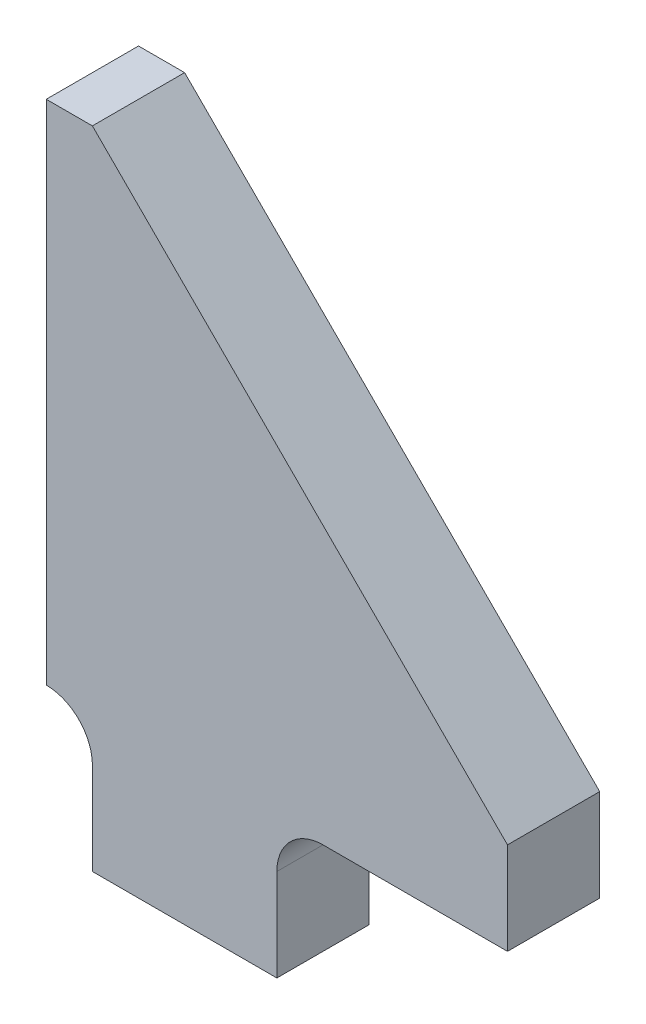
ISO-10303-21;
HEADER;
FILE_DESCRIPTION(('STEP AP214'),'2;1');
FILE_NAME('part.step','',(''),(''),'','','');
FILE_SCHEMA(('AUTOMOTIVE_DESIGN { 1 0 10303 214 1 1 1 1 }'));
ENDSEC;
DATA;
#1=APPLICATION_CONTEXT('core data for automotive mechanical design processes');
#2=APPLICATION_PROTOCOL_DEFINITION('international standard','automotive_design',2000,#1);
#3=PRODUCT_CONTEXT('',#1,'mechanical');
#4=PRODUCT('Part','Part','',(#3));
#5=PRODUCT_RELATED_PRODUCT_CATEGORY('part','',(#4));
#6=PRODUCT_DEFINITION_FORMATION('','',#4);
#7=PRODUCT_DEFINITION_CONTEXT('part definition',#1,'design');
#8=PRODUCT_DEFINITION('design','',#6,#7);
#9=PRODUCT_DEFINITION_SHAPE('','',#8);
#10=(LENGTH_UNIT() NAMED_UNIT(*) SI_UNIT(.MILLI.,.METRE.));
#11=(NAMED_UNIT(*) PLANE_ANGLE_UNIT() SI_UNIT($,.RADIAN.));
#12=(NAMED_UNIT(*) SI_UNIT($,.STERADIAN.) SOLID_ANGLE_UNIT());
#13=UNCERTAINTY_MEASURE_WITH_UNIT(LENGTH_MEASURE(1.E-05),#10,'distance_accuracy_value','');
#14=(GEOMETRIC_REPRESENTATION_CONTEXT(3) GLOBAL_UNCERTAINTY_ASSIGNED_CONTEXT((#13)) GLOBAL_UNIT_ASSIGNED_CONTEXT((#10,
#11,#12)) REPRESENTATION_CONTEXT('',''));
#15=CARTESIAN_POINT('',(0.,0.,0.));
#16=DIRECTION('',(0.,0.,1.));
#17=DIRECTION('',(1.,0.,0.));
#18=AXIS2_PLACEMENT_3D('',#15,#16,#17);
#19=CARTESIAN_POINT('',(1.,-3.,2.));
#20=DIRECTION('',(1.,0.,0.));
#21=DIRECTION('',(0.,0.,-1.));
#22=AXIS2_PLACEMENT_3D('',#19,#20,#21);
#23=PLANE('',#22);
#24=DIRECTION('',(0.,-1.,0.));
#25=VECTOR('',#24,1.);
#26=CARTESIAN_POINT('',(1.,-3.,2.));
#27=LINE('',#26,#25);
#28=CARTESIAN_POINT('',(1.,-1.,2.));
#29=VERTEX_POINT('',#28);
#30=CARTESIAN_POINT('',(1.,-3.,2.));
#31=VERTEX_POINT('',#30);
#32=EDGE_CURVE('E109',#29,#31,#27,.T.);
#33=ORIENTED_EDGE('',*,*,#32,.F.);
#34=DIRECTION('',(0.,0.,-1.));
#35=VECTOR('',#34,1.);
#36=CARTESIAN_POINT('',(1.,-1.,0.));
#37=LINE('',#36,#35);
#38=CARTESIAN_POINT('',(1.,-1.,0.));
#39=VERTEX_POINT('',#38);
#40=EDGE_CURVE('E128',#29,#39,#37,.T.);
#41=ORIENTED_EDGE('',*,*,#40,.T.);
#42=DIRECTION('',(0.,-1.,0.));
#43=VECTOR('',#42,1.);
#44=CARTESIAN_POINT('',(1.,-3.,0.));
#45=LINE('',#44,#43);
#46=CARTESIAN_POINT('',(1.,-3.,0.));
#47=VERTEX_POINT('',#46);
#48=EDGE_CURVE('E125',#39,#47,#45,.T.);
#49=ORIENTED_EDGE('',*,*,#48,.T.);
#50=DIRECTION('',(0.,0.,-1.));
#51=VECTOR('',#50,1.);
#52=CARTESIAN_POINT('',(1.,-3.,2.));
#53=LINE('',#52,#51);
#54=EDGE_CURVE('E123',#31,#47,#53,.T.);
#55=ORIENTED_EDGE('',*,*,#54,.F.);
#56=EDGE_LOOP('',(#33,#41,#49,#55));
#57=FACE_BOUND('',#56,.T.);
#58=ADVANCED_FACE('F33',(#57),#23,.F.);
#59=CARTESIAN_POINT('',(5.,-3.,2.));
#60=DIRECTION('',(0.,1.,0.));
#61=DIRECTION('',(-1.,0.,0.));
#62=AXIS2_PLACEMENT_3D('',#59,#60,#61);
#63=PLANE('',#62);
#64=DIRECTION('',(1.,0.,0.));
#65=VECTOR('',#64,1.);
#66=CARTESIAN_POINT('',(5.,-3.,0.));
#67=LINE('',#66,#65);
#68=CARTESIAN_POINT('',(5.,-3.,0.));
#69=VERTEX_POINT('',#68);
#70=EDGE_CURVE('E149',#47,#69,#67,.T.);
#71=ORIENTED_EDGE('',*,*,#70,.T.);
#72=DIRECTION('',(0.,0.,-1.));
#73=VECTOR('',#72,1.);
#74=CARTESIAN_POINT('',(5.,-3.,2.));
#75=LINE('',#74,#73);
#76=CARTESIAN_POINT('',(5.,-3.,2.));
#77=VERTEX_POINT('',#76);
#78=EDGE_CURVE('E129',#77,#69,#75,.T.);
#79=ORIENTED_EDGE('',*,*,#78,.F.);
#80=DIRECTION('',(1.,0.,0.));
#81=VECTOR('',#80,1.);
#82=CARTESIAN_POINT('',(5.,-3.,2.));
#83=LINE('',#82,#81);
#84=EDGE_CURVE('E113',#31,#77,#83,.T.);
#85=ORIENTED_EDGE('',*,*,#84,.F.);
#86=ORIENTED_EDGE('',*,*,#54,.T.);
#87=EDGE_LOOP('',(#71,#79,#85,#86));
#88=FACE_BOUND('',#87,.T.);
#89=ADVANCED_FACE('F131',(#88),#63,.F.);
#90=CARTESIAN_POINT('',(5.,0.,2.));
#91=DIRECTION('',(-1.,0.,0.));
#92=DIRECTION('',(0.,0.,1.));
#93=AXIS2_PLACEMENT_3D('',#90,#91,#92);
#94=PLANE('',#93);
#95=DIRECTION('',(0.,1.,0.));
#96=VECTOR('',#95,1.);
#97=CARTESIAN_POINT('',(5.,0.,0.));
#98=LINE('',#97,#96);
#99=CARTESIAN_POINT('',(5.,-1.,0.));
#100=VERTEX_POINT('',#99);
#101=EDGE_CURVE('E151',#69,#100,#98,.T.);
#102=ORIENTED_EDGE('',*,*,#101,.T.);
#103=DIRECTION('',(0.,0.,-1.));
#104=VECTOR('',#103,1.);
#105=CARTESIAN_POINT('',(5.,-1.,2.));
#106=LINE('',#105,#104);
#107=CARTESIAN_POINT('',(5.,-1.,2.));
#108=VERTEX_POINT('',#107);
#109=EDGE_CURVE('E48',#100,#108,#106,.F.);
#110=ORIENTED_EDGE('',*,*,#109,.T.);
#111=DIRECTION('',(0.,1.,0.));
#112=VECTOR('',#111,1.);
#113=CARTESIAN_POINT('',(5.,0.,2.));
#114=LINE('',#113,#112);
#115=EDGE_CURVE('E133',#77,#108,#114,.T.);
#116=ORIENTED_EDGE('',*,*,#115,.F.);
#117=ORIENTED_EDGE('',*,*,#78,.T.);
#118=EDGE_LOOP('',(#102,#110,#116,#117));
#119=FACE_BOUND('',#118,.T.);
#120=ADVANCED_FACE('F207',(#119),#94,.F.);
#121=CARTESIAN_POINT('',(10.,0.,2.));
#122=DIRECTION('',(0.,1.,0.));
#123=DIRECTION('',(-1.,0.,0.));
#124=AXIS2_PLACEMENT_3D('',#121,#122,#123);
#125=PLANE('',#124);
#126=DIRECTION('',(1.,0.,0.));
#127=VECTOR('',#126,1.);
#128=CARTESIAN_POINT('',(10.,0.,2.));
#129=LINE('',#128,#127);
#130=CARTESIAN_POINT('',(6.,0.,2.));
#131=VERTEX_POINT('',#130);
#132=CARTESIAN_POINT('',(10.,0.,2.));
#133=VERTEX_POINT('',#132);
#134=EDGE_CURVE('E135',#131,#133,#129,.T.);
#135=ORIENTED_EDGE('',*,*,#134,.F.);
#136=DIRECTION('',(0.,0.,-1.));
#137=VECTOR('',#136,1.);
#138=CARTESIAN_POINT('',(6.,0.,0.));
#139=LINE('',#138,#137);
#140=CARTESIAN_POINT('',(6.,0.,0.));
#141=VERTEX_POINT('',#140);
#142=EDGE_CURVE('E179',#131,#141,#139,.T.);
#143=ORIENTED_EDGE('',*,*,#142,.T.);
#144=DIRECTION('',(1.,0.,0.));
#145=VECTOR('',#144,1.);
#146=CARTESIAN_POINT('',(10.,0.,0.));
#147=LINE('',#146,#145);
#148=CARTESIAN_POINT('',(10.,0.,0.));
#149=VERTEX_POINT('',#148);
#150=EDGE_CURVE('E153',#141,#149,#147,.T.);
#151=ORIENTED_EDGE('',*,*,#150,.T.);
#152=DIRECTION('',(0.,0.,-1.));
#153=VECTOR('',#152,1.);
#154=CARTESIAN_POINT('',(10.,0.,2.));
#155=LINE('',#154,#153);
#156=EDGE_CURVE('E174',#133,#149,#155,.T.);
#157=ORIENTED_EDGE('',*,*,#156,.F.);
#158=EDGE_LOOP('',(#135,#143,#151,#157));
#159=FACE_BOUND('',#158,.T.);
#160=ADVANCED_FACE('F212',(#159),#125,.F.);
#161=CARTESIAN_POINT('',(10.,2.00000000000001,2.));
#162=DIRECTION('',(-1.,0.,0.));
#163=DIRECTION('',(0.,-1.,0.));
#164=AXIS2_PLACEMENT_3D('',#161,#162,#163);
#165=PLANE('',#164);
#166=DIRECTION('',(0.,1.,0.));
#167=VECTOR('',#166,1.);
#168=CARTESIAN_POINT('',(10.,2.00000000000001,0.));
#169=LINE('',#168,#167);
#170=CARTESIAN_POINT('',(10.,2.00000000000001,0.));
#171=VERTEX_POINT('',#170);
#172=EDGE_CURVE('E155',#149,#171,#169,.T.);
#173=ORIENTED_EDGE('',*,*,#172,.T.);
#174=DIRECTION('',(0.,0.,-1.));
#175=VECTOR('',#174,1.);
#176=CARTESIAN_POINT('',(10.,2.00000000000001,2.));
#177=LINE('',#176,#175);
#178=CARTESIAN_POINT('',(10.,2.00000000000001,2.));
#179=VERTEX_POINT('',#178);
#180=EDGE_CURVE('E171',#179,#171,#177,.T.);
#181=ORIENTED_EDGE('',*,*,#180,.F.);
#182=DIRECTION('',(0.,1.,0.));
#183=VECTOR('',#182,1.);
#184=CARTESIAN_POINT('',(10.,2.00000000000001,2.));
#185=LINE('',#184,#183);
#186=EDGE_CURVE('E139',#133,#179,#185,.T.);
#187=ORIENTED_EDGE('',*,*,#186,.F.);
#188=ORIENTED_EDGE('',*,*,#156,.T.);
#189=EDGE_LOOP('',(#173,#181,#187,#188));
#190=FACE_BOUND('',#189,.T.);
#191=ADVANCED_FACE('F215',(#190),#165,.F.);
#192=CARTESIAN_POINT('',(1.,11.,2.));
#193=DIRECTION('',(-0.707106781186547,-0.707106781186548,0.));
#194=DIRECTION('',(0.707106781186548,-0.707106781186547,0.));
#195=AXIS2_PLACEMENT_3D('',#192,#193,#194);
#196=PLANE('',#195);
#197=DIRECTION('',(-0.707106781186548,0.707106781186547,0.));
#198=VECTOR('',#197,1.);
#199=CARTESIAN_POINT('',(1.,11.,0.));
#200=LINE('',#199,#198);
#201=CARTESIAN_POINT('',(1.,11.,0.));
#202=VERTEX_POINT('',#201);
#203=EDGE_CURVE('E157',#171,#202,#200,.T.);
#204=ORIENTED_EDGE('',*,*,#203,.T.);
#205=DIRECTION('',(0.,0.,-1.));
#206=VECTOR('',#205,1.);
#207=CARTESIAN_POINT('',(1.,11.,2.));
#208=LINE('',#207,#206);
#209=CARTESIAN_POINT('',(1.,11.,2.));
#210=VERTEX_POINT('',#209);
#211=EDGE_CURVE('E168',#210,#202,#208,.T.);
#212=ORIENTED_EDGE('',*,*,#211,.F.);
#213=DIRECTION('',(-0.707106781186548,0.707106781186547,0.));
#214=VECTOR('',#213,1.);
#215=CARTESIAN_POINT('',(1.,11.,2.));
#216=LINE('',#215,#214);
#217=EDGE_CURVE('E141',#179,#210,#216,.T.);
#218=ORIENTED_EDGE('',*,*,#217,.F.);
#219=ORIENTED_EDGE('',*,*,#180,.T.);
#220=EDGE_LOOP('',(#204,#212,#218,#219));
#221=FACE_BOUND('',#220,.T.);
#222=ADVANCED_FACE('F219',(#221),#196,.F.);
#223=CARTESIAN_POINT('',(0.,11.,2.));
#224=DIRECTION('',(0.,-1.,0.));
#225=DIRECTION('',(0.,0.,-1.));
#226=AXIS2_PLACEMENT_3D('',#223,#224,#225);
#227=PLANE('',#226);
#228=DIRECTION('',(-1.,0.,0.));
#229=VECTOR('',#228,1.);
#230=CARTESIAN_POINT('',(0.,11.,0.));
#231=LINE('',#230,#229);
#232=CARTESIAN_POINT('',(0.,11.,0.));
#233=VERTEX_POINT('',#232);
#234=EDGE_CURVE('E159',#202,#233,#231,.T.);
#235=ORIENTED_EDGE('',*,*,#234,.T.);
#236=DIRECTION('',(0.,0.,-1.));
#237=VECTOR('',#236,1.);
#238=CARTESIAN_POINT('',(0.,11.,2.));
#239=LINE('',#238,#237);
#240=CARTESIAN_POINT('',(0.,11.,2.));
#241=VERTEX_POINT('',#240);
#242=EDGE_CURVE('E165',#241,#233,#239,.T.);
#243=ORIENTED_EDGE('',*,*,#242,.F.);
#244=DIRECTION('',(-1.,0.,0.));
#245=VECTOR('',#244,1.);
#246=CARTESIAN_POINT('',(0.,11.,2.));
#247=LINE('',#246,#245);
#248=EDGE_CURVE('E143',#210,#241,#247,.T.);
#249=ORIENTED_EDGE('',*,*,#248,.F.);
#250=ORIENTED_EDGE('',*,*,#211,.T.);
#251=EDGE_LOOP('',(#235,#243,#249,#250));
#252=FACE_BOUND('',#251,.T.);
#253=ADVANCED_FACE('F223',(#252),#227,.F.);
#254=CARTESIAN_POINT('',(0.,0.,2.));
#255=DIRECTION('',(1.,0.,0.));
#256=DIRECTION('',(0.,0.,-1.));
#257=AXIS2_PLACEMENT_3D('',#254,#255,#256);
#258=PLANE('',#257);
#259=DIRECTION('',(0.,-1.,0.));
#260=VECTOR('',#259,1.);
#261=CARTESIAN_POINT('',(0.,0.,0.));
#262=LINE('',#261,#260);
#263=CARTESIAN_POINT('',(0.,0.,0.));
#264=VERTEX_POINT('',#263);
#265=EDGE_CURVE('E120',#233,#264,#262,.T.);
#266=ORIENTED_EDGE('',*,*,#265,.T.);
#267=DIRECTION('',(0.,0.,-1.));
#268=VECTOR('',#267,1.);
#269=CARTESIAN_POINT('',(0.,0.,2.));
#270=LINE('',#269,#268);
#271=CARTESIAN_POINT('',(0.,0.,2.));
#272=VERTEX_POINT('',#271);
#273=EDGE_CURVE('E147',#272,#264,#270,.T.);
#274=ORIENTED_EDGE('',*,*,#273,.F.);
#275=DIRECTION('',(0.,-1.,0.));
#276=VECTOR('',#275,1.);
#277=CARTESIAN_POINT('',(0.,0.,2.));
#278=LINE('',#277,#276);
#279=EDGE_CURVE('E145',#241,#272,#278,.T.);
#280=ORIENTED_EDGE('',*,*,#279,.F.);
#281=ORIENTED_EDGE('',*,*,#242,.T.);
#282=EDGE_LOOP('',(#266,#274,#280,#281));
#283=FACE_BOUND('',#282,.T.);
#284=ADVANCED_FACE('F191',(#283),#258,.F.);
#285=CARTESIAN_POINT('',(0.,0.,2.));
#286=DIRECTION('',(0.,0.,-1.));
#287=DIRECTION('',(-1.,0.,0.));
#288=AXIS2_PLACEMENT_3D('',#285,#286,#287);
#289=PLANE('',#288);
#290=ORIENTED_EDGE('',*,*,#279,.T.);
#291=CARTESIAN_POINT('',(0.,-1.,2.));
#292=DIRECTION('',(0.,0.,-1.));
#293=DIRECTION('',(-1.,0.,0.));
#294=AXIS2_PLACEMENT_3D('',#291,#292,#293);
#295=CIRCLE('',#294,1.);
#296=EDGE_CURVE('E116',#272,#29,#295,.T.);
#297=ORIENTED_EDGE('',*,*,#296,.T.);
#298=ORIENTED_EDGE('',*,*,#32,.T.);
#299=ORIENTED_EDGE('',*,*,#84,.T.);
#300=ORIENTED_EDGE('',*,*,#115,.T.);
#301=CARTESIAN_POINT('',(6.,-1.,2.));
#302=DIRECTION('',(0.,0.,-1.));
#303=DIRECTION('',(-1.,0.,0.));
#304=AXIS2_PLACEMENT_3D('',#301,#302,#303);
#305=CIRCLE('',#304,1.);
#306=EDGE_CURVE('E11',#108,#131,#305,.T.);
#307=ORIENTED_EDGE('',*,*,#306,.T.);
#308=ORIENTED_EDGE('',*,*,#134,.T.);
#309=ORIENTED_EDGE('',*,*,#186,.T.);
#310=ORIENTED_EDGE('',*,*,#217,.T.);
#311=ORIENTED_EDGE('',*,*,#248,.T.);
#312=EDGE_LOOP('',(#290,#297,#298,#299,#300,#307,#308,#309,#310,#311));
#313=FACE_BOUND('',#312,.T.);
#314=ADVANCED_FACE('F111',(#313),#289,.F.);
#315=CARTESIAN_POINT('',(0.,0.,0.));
#316=DIRECTION('',(0.,0.,-1.));
#317=DIRECTION('',(-1.,0.,0.));
#318=AXIS2_PLACEMENT_3D('',#315,#316,#317);
#319=PLANE('',#318);
#320=ORIENTED_EDGE('',*,*,#48,.F.);
#321=CARTESIAN_POINT('',(0.,-1.,0.));
#322=DIRECTION('',(0.,0.,-1.));
#323=DIRECTION('',(-1.,0.,0.));
#324=AXIS2_PLACEMENT_3D('',#321,#322,#323);
#325=CIRCLE('',#324,1.);
#326=EDGE_CURVE('E183',#39,#264,#325,.F.);
#327=ORIENTED_EDGE('',*,*,#326,.T.);
#328=ORIENTED_EDGE('',*,*,#265,.F.);
#329=ORIENTED_EDGE('',*,*,#234,.F.);
#330=ORIENTED_EDGE('',*,*,#203,.F.);
#331=ORIENTED_EDGE('',*,*,#172,.F.);
#332=ORIENTED_EDGE('',*,*,#150,.F.);
#333=CARTESIAN_POINT('',(6.,-1.,0.));
#334=DIRECTION('',(0.,0.,-1.));
#335=DIRECTION('',(-1.,0.,0.));
#336=AXIS2_PLACEMENT_3D('',#333,#334,#335);
#337=CIRCLE('',#336,1.);
#338=EDGE_CURVE('E41',#141,#100,#337,.F.);
#339=ORIENTED_EDGE('',*,*,#338,.T.);
#340=ORIENTED_EDGE('',*,*,#101,.F.);
#341=ORIENTED_EDGE('',*,*,#70,.F.);
#342=EDGE_LOOP('',(#320,#327,#328,#329,#330,#331,#332,#339,#340,#341));
#343=FACE_BOUND('',#342,.T.);
#344=ADVANCED_FACE('F186',(#343),#319,.T.);
#345=CARTESIAN_POINT('',(0.,-1.,2.));
#346=DIRECTION('',(0.,0.,1.));
#347=DIRECTION('',(1.,0.,0.));
#348=AXIS2_PLACEMENT_3D('',#345,#346,#347);
#349=CYLINDRICAL_SURFACE('',#348,1.);
#350=ORIENTED_EDGE('',*,*,#296,.F.);
#351=ORIENTED_EDGE('',*,*,#273,.T.);
#352=ORIENTED_EDGE('',*,*,#326,.F.);
#353=ORIENTED_EDGE('',*,*,#40,.F.);
#354=EDGE_LOOP('',(#350,#351,#352,#353));
#355=FACE_BOUND('',#354,.T.);
#356=ADVANCED_FACE('F194',(#355),#349,.F.);
#357=CARTESIAN_POINT('',(6.,-1.,2.));
#358=DIRECTION('',(0.,0.,1.));
#359=DIRECTION('',(1.,0.,0.));
#360=AXIS2_PLACEMENT_3D('',#357,#358,#359);
#361=CYLINDRICAL_SURFACE('',#360,1.);
#362=ORIENTED_EDGE('',*,*,#306,.F.);
#363=ORIENTED_EDGE('',*,*,#109,.F.);
#364=ORIENTED_EDGE('',*,*,#338,.F.);
#365=ORIENTED_EDGE('',*,*,#142,.F.);
#366=EDGE_LOOP('',(#362,#363,#364,#365));
#367=FACE_BOUND('',#366,.T.);
#368=ADVANCED_FACE('F35',(#367),#361,.F.);
#369=CLOSED_SHELL('',(#58,#89,#120,#160,#191,#222,#253,#284,#314,#344,#356,#368));
#370=MANIFOLD_SOLID_BREP('B2',#369);
#371=ADVANCED_BREP_SHAPE_REPRESENTATION('',(#18,#370),#14);
#372=SHAPE_DEFINITION_REPRESENTATION(#9,#371);
ENDSEC;
END-ISO-10303-21;
